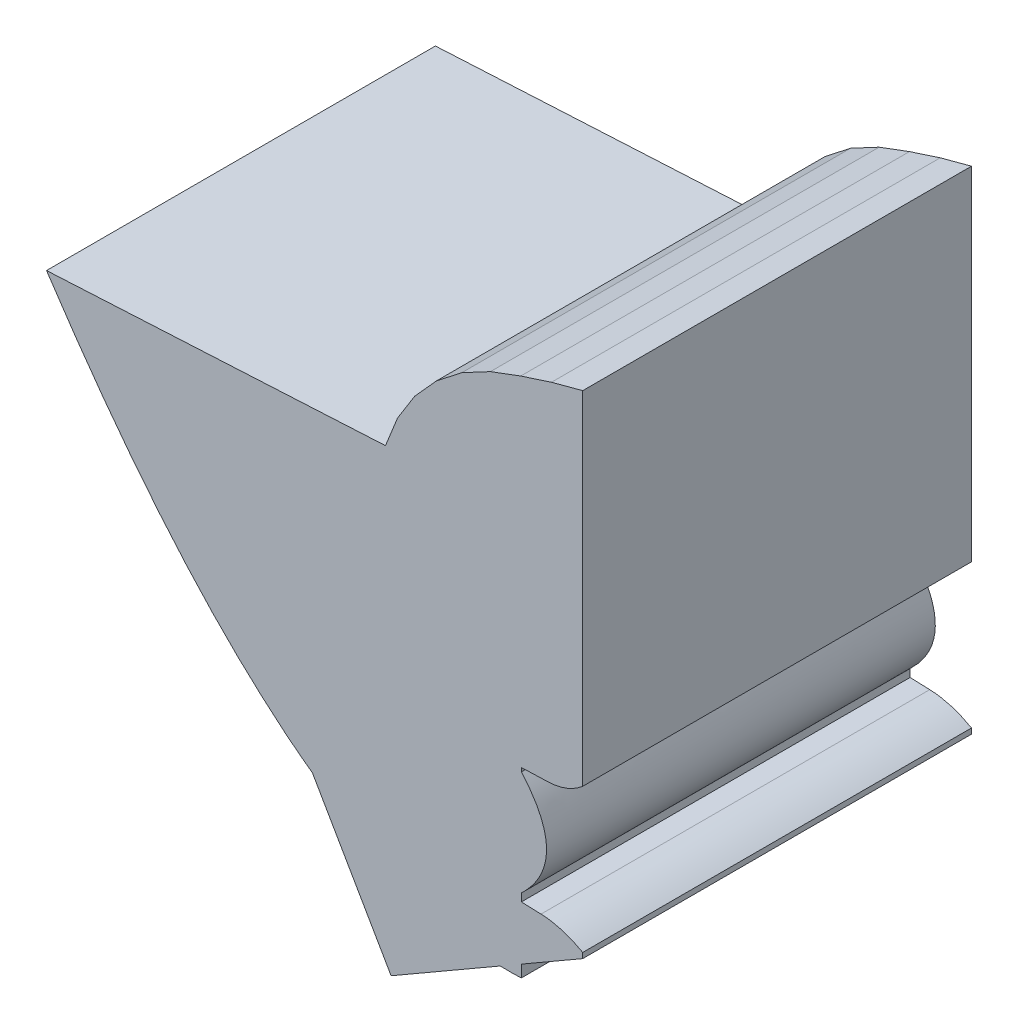
ISO-10303-21;
HEADER;
FILE_DESCRIPTION(('STEP AP214'),'2;1');
FILE_NAME('part.step','',(''),(''),'','','');
FILE_SCHEMA(('AUTOMOTIVE_DESIGN { 1 0 10303 214 1 1 1 1 }'));
ENDSEC;
DATA;
#1=APPLICATION_CONTEXT('core data for automotive mechanical design processes');
#2=APPLICATION_PROTOCOL_DEFINITION('international standard','automotive_design',2000,#1);
#3=PRODUCT_CONTEXT('',#1,'mechanical');
#4=PRODUCT('Part','Part','',(#3));
#5=PRODUCT_RELATED_PRODUCT_CATEGORY('part','',(#4));
#6=PRODUCT_DEFINITION_FORMATION('','',#4);
#7=PRODUCT_DEFINITION_CONTEXT('part definition',#1,'design');
#8=PRODUCT_DEFINITION('design','',#6,#7);
#9=PRODUCT_DEFINITION_SHAPE('','',#8);
#10=(LENGTH_UNIT() NAMED_UNIT(*) SI_UNIT(.MILLI.,.METRE.));
#11=(NAMED_UNIT(*) PLANE_ANGLE_UNIT() SI_UNIT($,.RADIAN.));
#12=(NAMED_UNIT(*) SI_UNIT($,.STERADIAN.) SOLID_ANGLE_UNIT());
#13=UNCERTAINTY_MEASURE_WITH_UNIT(LENGTH_MEASURE(1.E-05),#10,'distance_accuracy_value','');
#14=(GEOMETRIC_REPRESENTATION_CONTEXT(3) GLOBAL_UNCERTAINTY_ASSIGNED_CONTEXT((#13)) GLOBAL_UNIT_ASSIGNED_CONTEXT((#10,
#11,#12)) REPRESENTATION_CONTEXT('',''));
#15=CARTESIAN_POINT('',(0.,0.,0.));
#16=DIRECTION('',(0.,0.,1.));
#17=DIRECTION('',(1.,0.,0.));
#18=AXIS2_PLACEMENT_3D('',#15,#16,#17);
#19=CARTESIAN_POINT('',(-2.17733041778456,0.,7.21));
#20=DIRECTION('',(1.,0.,0.));
#21=DIRECTION('',(0.,1.,0.));
#22=AXIS2_PLACEMENT_3D('',#19,#20,#21);
#23=PLANE('',#22);
#24=DIRECTION('',(0.,1.,0.));
#25=VECTOR('',#24,1.);
#26=CARTESIAN_POINT('',(-2.17733041778456,0.,7.21));
#27=LINE('',#26,#25);
#28=CARTESIAN_POINT('',(-2.17733041779455,-1.68817652024789,7.21));
#29=VERTEX_POINT('',#28);
#30=CARTESIAN_POINT('',(-2.17733041778456,-1.97588987280662,7.21));
#31=VERTEX_POINT('',#30);
#32=EDGE_CURVE('E331',#29,#31,#27,.F.);
#33=ORIENTED_EDGE('',*,*,#32,.T.);
#34=DIRECTION('',(0.,0.,-1.));
#35=VECTOR('',#34,1.);
#36=CARTESIAN_POINT('',(-2.17733041778456,-1.97588987280662,7.21));
#37=LINE('',#36,#35);
#38=CARTESIAN_POINT('',(-2.17733041778456,-1.97588987280662,-7.21));
#39=VERTEX_POINT('',#38);
#40=EDGE_CURVE('E707',#31,#39,#37,.T.);
#41=ORIENTED_EDGE('',*,*,#40,.T.);
#42=DIRECTION('',(0.,1.,0.));
#43=VECTOR('',#42,1.);
#44=CARTESIAN_POINT('',(-2.17733041778456,0.,-7.21));
#45=LINE('',#44,#43);
#46=CARTESIAN_POINT('',(-2.17733041778456,-1.68817652020115,-7.21));
#47=VERTEX_POINT('',#46);
#48=EDGE_CURVE('E239',#47,#39,#45,.F.);
#49=ORIENTED_EDGE('',*,*,#48,.F.);
#50=DIRECTION('',(0.,0.,-1.));
#51=VECTOR('',#50,1.);
#52=CARTESIAN_POINT('',(-2.17733041778328,-1.68817652023794,30.8299178698776));
#53=LINE('',#52,#51);
#54=EDGE_CURVE('E306',#29,#47,#53,.T.);
#55=ORIENTED_EDGE('',*,*,#54,.F.);
#56=EDGE_LOOP('',(#33,#41,#49,#55));
#57=FACE_BOUND('',#56,.T.);
#58=ADVANCED_FACE('F60',(#57),#23,.T.);
#59=CARTESIAN_POINT('',(-2.17733041778456,-3.97362839535961,-7.21));
#60=VERTEX_POINT('',#59);
#61=CARTESIAN_POINT('',(-2.17733041883694,-4.4181521924004,-7.21253661769719));
#62=VERTEX_POINT('',#61);
#63=EDGE_CURVE('E291',#60,#62,#45,.F.);
#64=ORIENTED_EDGE('',*,*,#63,.F.);
#65=DIRECTION('',(0.,0.,1.));
#66=VECTOR('',#65,1.);
#67=CARTESIAN_POINT('',(-2.17733041778456,-3.97362839535961,7.21));
#68=LINE('',#67,#66);
#69=CARTESIAN_POINT('',(-2.17733041778456,-3.97362839535961,7.21));
#70=VERTEX_POINT('',#69);
#71=EDGE_CURVE('E277',#60,#70,#68,.T.);
#72=ORIENTED_EDGE('',*,*,#71,.T.);
#73=CARTESIAN_POINT('',(-2.17733041778728,-4.418152192393,7.21251805157701));
#74=VERTEX_POINT('',#73);
#75=EDGE_CURVE('E315',#70,#74,#27,.F.);
#76=ORIENTED_EDGE('',*,*,#75,.T.);
#77=DIRECTION('',(0.,0.,1.));
#78=VECTOR('',#77,1.);
#79=CARTESIAN_POINT('',(-2.17733041988932,-4.41815219245795,-7.21507323539439));
#80=LINE('',#79,#78);
#81=EDGE_CURVE('E297',#62,#74,#80,.T.);
#82=ORIENTED_EDGE('',*,*,#81,.F.);
#83=EDGE_LOOP('',(#64,#72,#76,#82));
#84=FACE_BOUND('',#83,.T.);
#85=ADVANCED_FACE('F300',(#84),#23,.T.);
#86=CARTESIAN_POINT('',(-82931.1005830976,996560.072871644,30.8299178698776));
#87=CARTESIAN_POINT('',(87153.8887538027,-996199.093812144,30.8299178698776));
#88=CARTESIAN_POINT('',(-91384.0928999308,995820.531871049,30.8299178698776));
#89=B_SPLINE_CURVE_WITH_KNOTS('',2,(#86,#87,#88),.UNSPECIFIED.,.F.,.F.,(3,3),(0.,1.),.UNSPECIFIED.);
#90=DIRECTION('',(0.,0.,-1.));
#91=VECTOR('',#90,1.);
#92=SURFACE_OF_LINEAR_EXTRUSION('',#89,#91);
#93=CARTESIAN_POINT('',(-10.3360060158833,-1.39847805226083,-7.21));
#94=CARTESIAN_POINT('',(-10.1317122861946,-1.55409126755817,-7.21));
#95=CARTESIAN_POINT('',(-9.92811739885524,-1.70171667825081,-7.21));
#96=B_SPLINE_CURVE_WITH_KNOTS('',2,(#93,#94,#95),.UNSPECIFIED.,.F.,.F.,(3,3),(0.500920252473167,
0.500965025000237),.UNSPECIFIED.);
#97=CARTESIAN_POINT('',(-10.3360060158632,-1.39847805228234,-7.2125366176972));
#98=VERTEX_POINT('',#97);
#99=CARTESIAN_POINT('',(-9.92811739884048,-1.70171667826735,-7.21));
#100=VERTEX_POINT('',#99);
#101=EDGE_CURVE('E684',#98,#100,#96,.T.);
#102=ORIENTED_EDGE('',*,*,#101,.T.);
#103=CARTESIAN_POINT('',(-9.92303039020492,-1.70540406952979,-7.21));
#104=DIRECTION('',(0.,0.,1.));
#105=VECTOR('',#104,1.);
#106=LINE('',#103,#105);
#107=CARTESIAN_POINT('',(-9.92811740939357,-1.70171667064013,7.21));
#108=VERTEX_POINT('',#107);
#109=EDGE_CURVE('E13',#100,#108,#106,.T.);
#110=ORIENTED_EDGE('',*,*,#109,.T.);
#111=CARTESIAN_POINT('',(-9.9281174093746,-1.70171667065055,7.21));
#112=CARTESIAN_POINT('',(-10.1317122914709,-1.55409126356634,7.21));
#113=CARTESIAN_POINT('',(-10.3360060158804,-1.39847805229025,7.20999999999999));
#114=B_SPLINE_CURVE_WITH_KNOTS('',2,(#111,#112,#113),.UNSPECIFIED.,.F.,.F.,(3,3),
(0.500920252474324,0.500965025000236),.UNSPECIFIED.);
#115=CARTESIAN_POINT('',(-10.3360060158816,-1.39847805227263,7.21251805157951));
#116=VERTEX_POINT('',#115);
#117=EDGE_CURVE('E470',#116,#108,#114,.F.);
#118=ORIENTED_EDGE('',*,*,#117,.F.);
#119=CARTESIAN_POINT('',(-10.336006015861,-1.39847805228632,7.21));
#120=CARTESIAN_POINT('',(-10.6228848167366,-1.17995870432205,7.21));
#121=CARTESIAN_POINT('',(-10.9111416710362,-0.945688133646021,7.21));
#122=B_SPLINE_CURVE_WITH_KNOTS('',2,(#119,#120,#121),.UNSPECIFIED.,.F.,.F.,(3,3),
(0.500965025000234,0.501027896674745),.UNSPECIFIED.);
#123=CARTESIAN_POINT('',(-10.9111416711035,-0.945688133586594,7.21251805157951));
#124=VERTEX_POINT('',#123);
#125=EDGE_CURVE('E325',#124,#116,#122,.F.);
#126=ORIENTED_EDGE('',*,*,#125,.F.);
#127=CARTESIAN_POINT('',(-10.9111416711694,-0.945688133531575,7.21));
#128=CARTESIAN_POINT('',(-15.1971813204195,2.53763911301365,7.21));
#129=CARTESIAN_POINT('',(-19.7878835648669,9.50327575735757,7.21));
#130=B_SPLINE_CURVE_WITH_KNOTS('',2,(#127,#128,#129),.UNSPECIFIED.,.F.,.F.,(3,3),
(0.501027896674761,0.501962724366634),.UNSPECIFIED.);
#131=CARTESIAN_POINT('',(-19.7878835648708,9.50327575735899,7.21251805157951));
#132=VERTEX_POINT('',#131);
#133=EDGE_CURVE('E345',#132,#124,#130,.F.);
#134=ORIENTED_EDGE('',*,*,#133,.F.);
#135=DIRECTION('',(0.,0.,1.));
#136=VECTOR('',#135,1.);
#137=CARTESIAN_POINT('',(-19.7878835648708,9.50327575735899,-7.21507323539439));
#138=LINE('',#137,#136);
#139=CARTESIAN_POINT('',(-19.7878835648708,9.50327575735899,-7.21253661769719));
#140=VERTEX_POINT('',#139);
#141=EDGE_CURVE('E467',#140,#132,#138,.T.);
#142=ORIENTED_EDGE('',*,*,#141,.F.);
#143=CARTESIAN_POINT('',(-19.7878835648714,9.50327575734023,-7.21));
#144=CARTESIAN_POINT('',(-15.197181319061,2.53763911092818,-7.21));
#145=CARTESIAN_POINT('',(-10.9111416686287,-0.945688135617351,-7.21));
#146=B_SPLINE_CURVE_WITH_KNOTS('',2,(#143,#144,#145),.UNSPECIFIED.,.F.,.F.,(3,3),
(0.501027896674483,0.501962724366634),.UNSPECIFIED.);
#147=CARTESIAN_POINT('',(-10.9111416684846,-0.945688135711886,-7.21253661769719));
#148=VERTEX_POINT('',#147);
#149=EDGE_CURVE('E465',#140,#148,#146,.T.);
#150=ORIENTED_EDGE('',*,*,#149,.T.);
#151=CARTESIAN_POINT('',(-10.9111416684921,-0.945688135713634,-7.21));
#152=CARTESIAN_POINT('',(-10.6228848154707,-1.17995870528634,-7.21));
#153=CARTESIAN_POINT('',(-10.336006015861,-1.39847805228632,-7.21));
#154=B_SPLINE_CURVE_WITH_KNOTS('',2,(#151,#152,#153),.UNSPECIFIED.,.F.,.F.,(3,3),
(0.500965025000234,0.501027896674468),.UNSPECIFIED.);
#155=EDGE_CURVE('E301',#148,#98,#154,.T.);
#156=ORIENTED_EDGE('',*,*,#155,.T.);
#157=EDGE_LOOP('',(#102,#110,#118,#126,#134,#142,#150,#156));
#158=FACE_BOUND('',#157,.T.);
#159=ADVANCED_FACE('F351',(#158),#92,.T.);
#160=CARTESIAN_POINT('',(-2.17733041779322,-4.41815219232809,7.21));
#161=CARTESIAN_POINT('',(-2.56635847851917,-4.43811718715954,7.21));
#162=CARTESIAN_POINT('',(-2.95832165330017,-4.42453367482725,7.21));
#163=B_SPLINE_CURVE_WITH_KNOTS('',2,(#160,#161,#162),.UNSPECIFIED.,.F.,.F.,(3,3),
(0.500038190982026,0.500129946985932),.UNSPECIFIED.);
#164=CARTESIAN_POINT('',(-2.95832155779568,-4.42453384027707,7.21));
#165=VERTEX_POINT('',#164);
#166=EDGE_CURVE('E449',#165,#74,#163,.F.);
#167=ORIENTED_EDGE('',*,*,#166,.F.);
#168=DIRECTION('',(0.,0.,-1.));
#169=VECTOR('',#168,1.);
#170=CARTESIAN_POINT('',(-2.95832129285944,-4.42453368731519,0.));
#171=LINE('',#170,#169);
#172=CARTESIAN_POINT('',(-2.95832165333745,-4.42453367485076,-7.21));
#173=VERTEX_POINT('',#172);
#174=EDGE_CURVE('E69',#165,#173,#171,.T.);
#175=ORIENTED_EDGE('',*,*,#174,.T.);
#176=CARTESIAN_POINT('',(-2.95832165333676,-4.42453367484836,-7.21));
#177=CARTESIAN_POINT('',(-2.56635847959284,-4.43811718714624,-7.21));
#178=CARTESIAN_POINT('',(-2.17733041988843,-4.41815219245793,-7.21));
#179=B_SPLINE_CURVE_WITH_KNOTS('',2,(#176,#177,#178),.UNSPECIFIED.,.F.,.F.,(3,3),
(0.500038190982273,0.500129946985936),.UNSPECIFIED.);
#180=EDGE_CURVE('E335',#173,#62,#179,.T.);
#181=ORIENTED_EDGE('',*,*,#180,.T.);
#182=ORIENTED_EDGE('',*,*,#81,.T.);
#183=EDGE_LOOP('',(#167,#175,#181,#182));
#184=FACE_BOUND('',#183,.T.);
#185=ADVANCED_FACE('F365',(#184),#92,.T.);
#186=DIRECTION('',(0.,1.,0.));
#187=VECTOR('',#186,1.);
#188=CARTESIAN_POINT('',(-2.17733041778456,0.,-7.21));
#189=LINE('',#188,#187);
#190=CARTESIAN_POINT('',(-2.17733041778456,2.34248700715526,-7.21));
#191=VERTEX_POINT('',#190);
#192=CARTESIAN_POINT('',(-2.17733041777607,2.20172974209443,-7.21));
#193=VERTEX_POINT('',#192);
#194=EDGE_CURVE('E303',#191,#193,#189,.F.);
#195=ORIENTED_EDGE('',*,*,#194,.F.);
#196=DIRECTION('',(0.,0.,-1.));
#197=VECTOR('',#196,1.);
#198=CARTESIAN_POINT('',(-2.17733041778456,2.34248700715526,24.0565253000013));
#199=LINE('',#198,#197);
#200=CARTESIAN_POINT('',(-2.17733041778456,2.34248700715526,7.21));
#201=VERTEX_POINT('',#200);
#202=EDGE_CURVE('E527',#201,#191,#199,.T.);
#203=ORIENTED_EDGE('',*,*,#202,.F.);
#204=DIRECTION('',(0.,1.,0.));
#205=VECTOR('',#204,1.);
#206=CARTESIAN_POINT('',(-2.17733041778456,0.,7.21));
#207=LINE('',#206,#205);
#208=CARTESIAN_POINT('',(-2.17733041778074,2.20172974210003,7.21));
#209=VERTEX_POINT('',#208);
#210=EDGE_CURVE('E326',#201,#209,#207,.F.);
#211=ORIENTED_EDGE('',*,*,#210,.T.);
#212=DIRECTION('',(0.,0.,-1.));
#213=VECTOR('',#212,1.);
#214=CARTESIAN_POINT('',(-2.17733041778074,2.20172974210003,30.8299178698776));
#215=LINE('',#214,#213);
#216=EDGE_CURVE('E611',#209,#193,#215,.T.);
#217=ORIENTED_EDGE('',*,*,#216,.T.);
#218=EDGE_LOOP('',(#195,#203,#211,#217));
#219=FACE_BOUND('',#218,.T.);
#220=ADVANCED_FACE('F595',(#219),#23,.T.);
#221=CARTESIAN_POINT('',(0.,0.,7.21));
#222=DIRECTION('',(0.,0.,1.));
#223=DIRECTION('',(1.,0.,0.));
#224=AXIS2_PLACEMENT_3D('',#221,#222,#223);
#225=PLANE('',#224);
#226=ORIENTED_EDGE('',*,*,#75,.F.);
#227=DIRECTION('',(0.866025403785723,0.499999999997775,0.));
#228=VECTOR('',#227,1.);
#229=CARTESIAN_POINT('',(0.100000000004221,-2.65881106562334,7.21));
#230=LINE('',#229,#228);
#231=CARTESIAN_POINT('',(0.100000000004221,-2.65881106562334,7.21));
#232=VERTEX_POINT('',#231);
#233=EDGE_CURVE('E74',#70,#232,#230,.T.);
#234=ORIENTED_EDGE('',*,*,#233,.T.);
#235=DIRECTION('',(-1.62011653008151E-11,1.,0.));
#236=VECTOR('',#235,1.);
#237=CARTESIAN_POINT('',(0.100000000000981,-2.45881106562334,7.21));
#238=LINE('',#237,#236);
#239=CARTESIAN_POINT('',(0.100000000000981,-2.45881106562334,7.21));
#240=VERTEX_POINT('',#239);
#241=EDGE_CURVE('E667',#232,#240,#238,.T.);
#242=ORIENTED_EDGE('',*,*,#241,.T.);
#243=CARTESIAN_POINT('',(-15004.7897636461,-999892.444646946,7.21));
#244=CARTESIAN_POINT('',(17450.906437277,999845.695156391,7.21));
#245=CARTESIAN_POINT('',(-19903.023110908,-999806.945665836,7.21));
#246=B_SPLINE_CURVE_WITH_KNOTS('',2,(#243,#244,#245),.UNSPECIFIED.,.F.,.F.,(3,3),(0.,1.),.UNSPECIFIED.);
#247=CARTESIAN_POINT('',(-1.44765075676889,-2.00137084805176,7.21));
#248=VERTEX_POINT('',#247);
#249=EDGE_CURVE('E671',#240,#248,#246,.T.);
#250=ORIENTED_EDGE('',*,*,#249,.T.);
#251=DIRECTION('',(-0.999390827019096,0.0348994967024967,0.));
#252=VECTOR('',#251,1.);
#253=CARTESIAN_POINT('',(-1.44765075676889,-2.00137084805176,7.21));
#254=LINE('',#253,#252);
#255=EDGE_CURVE('E248',#248,#31,#254,.T.);
#256=ORIENTED_EDGE('',*,*,#255,.T.);
#257=ORIENTED_EDGE('',*,*,#32,.F.);
#258=CARTESIAN_POINT('',(-2.17733041777607,2.20172974209443,7.21));
#259=CARTESIAN_POINT('',(-0.307419303310444,0.0931805865995528,7.21));
#260=CARTESIAN_POINT('',(-2.17733041779435,-1.68817652026,7.21));
#261=B_SPLINE_CURVE_WITH_KNOTS('',2,(#258,#259,#260),.UNSPECIFIED.,.F.,.F.,(3,3),
(0.49947186766891,0.500440643667569),.UNSPECIFIED.);
#262=EDGE_CURVE('E645',#209,#29,#261,.T.);
#263=ORIENTED_EDGE('',*,*,#262,.F.);
#264=ORIENTED_EDGE('',*,*,#210,.F.);
#265=DIRECTION('',(0.999390827019096,0.0348994967025048,0.));
#266=VECTOR('',#265,1.);
#267=CARTESIAN_POINT('',(-2.17733041778456,2.34248700715526,7.21));
#268=LINE('',#267,#266);
#269=CARTESIAN_POINT('',(-1.19050164048462,2.37694782742692,7.21000000000002));
#270=VERTEX_POINT('',#269);
#271=EDGE_CURVE('E474',#201,#270,#268,.T.);
#272=ORIENTED_EDGE('',*,*,#271,.T.);
#273=CARTESIAN_POINT('',(-343900.072311573,939011.080499257,7.21000000000001));
#274=CARTESIAN_POINT('',(342019.599581338,-939690.120785908,7.21000000000001));
#275=CARTESIAN_POINT('',(-340141.301828429,940379.16107256,7.21000000000001));
#276=B_SPLINE_CURVE_WITH_KNOTS('',2,(#273,#274,#275),.UNSPECIFIED.,.F.,.F.,(3,3),(0.,1.),.UNSPECIFIED.);
#277=CARTESIAN_POINT('',(0.100000000004221,2.87767341815847,7.21000000000001));
#278=VERTEX_POINT('',#277);
#279=EDGE_CURVE('E468',#270,#278,#276,.T.);
#280=ORIENTED_EDGE('',*,*,#279,.T.);
#281=DIRECTION('',(0.,1.,0.));
#282=VECTOR('',#281,1.);
#283=CARTESIAN_POINT('',(0.100000000004221,2.87767341815847,7.21));
#284=LINE('',#283,#282);
#285=CARTESIAN_POINT('',(0.100000000004747,15.587903347272,7.21));
#286=VERTEX_POINT('',#285);
#287=EDGE_CURVE('E509',#278,#286,#284,.T.);
#288=ORIENTED_EDGE('',*,*,#287,.T.);
#289=DIRECTION('',(-0.96592582628907,-0.258819045102515,0.));
#290=VECTOR('',#289,1.);
#291=CARTESIAN_POINT('',(-1.05911099154214,15.277320493149,7.21));
#292=LINE('',#291,#290);
#293=CARTESIAN_POINT('',(-1.05911099154214,15.277320493149,7.21000000000001));
#294=VERTEX_POINT('',#293);
#295=EDGE_CURVE('E510',#286,#294,#292,.T.);
#296=ORIENTED_EDGE('',*,*,#295,.T.);
#297=DIRECTION('',(-0.951056516295155,-0.309016994374943,0.));
#298=VECTOR('',#297,1.);
#299=CARTESIAN_POINT('',(-2.20037881109632,14.906500099899,7.21));
#300=LINE('',#299,#298);
#301=CARTESIAN_POINT('',(-2.20037881109632,14.906500099899,7.21000000000001));
#302=VERTEX_POINT('',#301);
#303=EDGE_CURVE('E502',#294,#302,#300,.T.);
#304=ORIENTED_EDGE('',*,*,#303,.T.);
#305=DIRECTION('',(-0.9366721892484,-0.350207381259461,0.));
#306=VECTOR('',#305,1.);
#307=CARTESIAN_POINT('',(-3.3243854381944,14.4862512423877,7.21));
#308=LINE('',#307,#306);
#309=CARTESIAN_POINT('',(-3.3243854381944,14.4862512423877,7.21000000000001));
#310=VERTEX_POINT('',#309);
#311=EDGE_CURVE('E501',#302,#310,#308,.T.);
#312=ORIENTED_EDGE('',*,*,#311,.T.);
#313=DIRECTION('',(-0.882947592859007,-0.46947156278574,0.));
#314=VECTOR('',#313,1.);
#315=CARTESIAN_POINT('',(-4.38392254962521,13.9228853670448,7.21));
#316=LINE('',#315,#314);
#317=CARTESIAN_POINT('',(-4.38392254962521,13.9228853670448,7.21000000000001));
#318=VERTEX_POINT('',#317);
#319=EDGE_CURVE('E498',#310,#318,#316,.T.);
#320=ORIENTED_EDGE('',*,*,#319,.T.);
#321=DIRECTION('',(-0.788010753606726,-0.615661475325654,0.));
#322=VECTOR('',#321,1.);
#323=CARTESIAN_POINT('',(-5.32953545395328,13.184091596654,7.21));
#324=LINE('',#323,#322);
#325=CARTESIAN_POINT('',(-5.32953545395328,13.184091596654,7.21000000000001));
#326=VERTEX_POINT('',#325);
#327=EDGE_CURVE('E492',#318,#326,#324,.T.);
#328=ORIENTED_EDGE('',*,*,#327,.T.);
#329=DIRECTION('',(-0.669130606358526,-0.743144825477694,0.));
#330=VECTOR('',#329,1.);
#331=CARTESIAN_POINT('',(-6.13249218158351,12.2923178060808,7.21));
#332=LINE('',#331,#330);
#333=CARTESIAN_POINT('',(-6.13249218158351,12.2923178060808,7.21000000000001));
#334=VERTEX_POINT('',#333);
#335=EDGE_CURVE('E495',#326,#334,#332,.T.);
#336=ORIENTED_EDGE('',*,*,#335,.T.);
#337=DIRECTION('',(-0.52991926423321,-0.848048096156423,0.));
#338=VECTOR('',#337,1.);
#339=CARTESIAN_POINT('',(-6.76839529866336,11.2746600906931,7.21));
#340=LINE('',#339,#338);
#341=CARTESIAN_POINT('',(-6.76839529866336,11.2746600906931,7.21000000000001));
#342=VERTEX_POINT('',#341);
#343=EDGE_CURVE('E490',#334,#342,#340,.T.);
#344=ORIENTED_EDGE('',*,*,#343,.T.);
#345=DIRECTION('',(-0.374606593415918,-0.927183854566785,0.));
#346=VECTOR('',#345,1.);
#347=CARTESIAN_POINT('',(-7.21792321076246,10.1620394652129,7.21));
#348=LINE('',#347,#346);
#349=CARTESIAN_POINT('',(-7.21792321076246,10.1620394652129,7.21000000000001));
#350=VERTEX_POINT('',#349);
#351=EDGE_CURVE('E479',#342,#350,#348,.T.);
#352=ORIENTED_EDGE('',*,*,#351,.T.);
#353=DIRECTION('',(-0.998629534754494,-0.0523359562444688,0.));
#354=VECTOR('',#353,1.);
#355=CARTESIAN_POINT('',(-10.3098203952063,10.,7.21));
#356=LINE('',#355,#354);
#357=EDGE_CURVE('E318',#350,#132,#356,.T.);
#358=ORIENTED_EDGE('',*,*,#357,.T.);
#359=ORIENTED_EDGE('',*,*,#133,.T.);
#360=ORIENTED_EDGE('',*,*,#125,.T.);
#361=ORIENTED_EDGE('',*,*,#117,.T.);
#362=DIRECTION('',(0.500000000000004,-0.866025403784436,0.));
#363=VECTOR('',#362,1.);
#364=CARTESIAN_POINT('',(-9.92906628699395,-1.70519329135708,7.21));
#365=LINE('',#364,#363);
#366=CARTESIAN_POINT('',(-7.00887110624745,-6.76311971242774,7.21));
#367=VERTEX_POINT('',#366);
#368=EDGE_CURVE('E669',#108,#367,#365,.T.);
#369=ORIENTED_EDGE('',*,*,#368,.T.);
#370=EDGE_CURVE('E274',#367,#165,#230,.T.);
#371=ORIENTED_EDGE('',*,*,#370,.T.);
#372=ORIENTED_EDGE('',*,*,#166,.T.);
#373=EDGE_LOOP('',(#226,#234,#242,#250,#256,#257,#263,#264,#272,#280,#288,#296,#304,#312,#320,
#328,#336,#344,#352,#358,#359,#360,#361,#369,#371,#372));
#374=FACE_BOUND('',#373,.T.);
#375=ADVANCED_FACE('F423',(#374),#225,.T.);
#376=CARTESIAN_POINT('',(0.,0.,-7.21));
#377=DIRECTION('',(0.,0.,1.));
#378=DIRECTION('',(1.,0.,0.));
#379=AXIS2_PLACEMENT_3D('',#376,#377,#378);
#380=PLANE('',#379);
#381=ORIENTED_EDGE('',*,*,#48,.T.);
#382=DIRECTION('',(0.999390827019096,-0.0348994967024967,0.));
#383=VECTOR('',#382,1.);
#384=CARTESIAN_POINT('',(-1.44765075676889,-2.00137084805176,-7.21));
#385=LINE('',#384,#383);
#386=CARTESIAN_POINT('',(-1.44765075676889,-2.00137084805176,-7.21));
#387=VERTEX_POINT('',#386);
#388=EDGE_CURVE('E235',#39,#387,#385,.T.);
#389=ORIENTED_EDGE('',*,*,#388,.T.);
#390=CARTESIAN_POINT('',(-15004.7897636461,-999892.444646946,-7.21));
#391=CARTESIAN_POINT('',(17450.906437277,999845.695156391,-7.21));
#392=CARTESIAN_POINT('',(-19903.023110908,-999806.945665836,-7.21));
#393=B_SPLINE_CURVE_WITH_KNOTS('',2,(#390,#391,#392),.UNSPECIFIED.,.F.,.F.,(3,3),(0.,1.),.UNSPECIFIED.);
#394=CARTESIAN_POINT('',(0.100000000000981,-2.45881106562334,-7.21));
#395=VERTEX_POINT('',#394);
#396=EDGE_CURVE('E240',#387,#395,#393,.F.);
#397=ORIENTED_EDGE('',*,*,#396,.T.);
#398=DIRECTION('',(1.62011653008151E-11,-1.,0.));
#399=VECTOR('',#398,1.);
#400=CARTESIAN_POINT('',(0.100000000000981,-2.45881106562334,-7.21));
#401=LINE('',#400,#399);
#402=CARTESIAN_POINT('',(0.100000000004221,-2.65881106562334,-7.21));
#403=VERTEX_POINT('',#402);
#404=EDGE_CURVE('E256',#395,#403,#401,.T.);
#405=ORIENTED_EDGE('',*,*,#404,.T.);
#406=DIRECTION('',(-0.866025403785723,-0.499999999997775,0.));
#407=VECTOR('',#406,1.);
#408=CARTESIAN_POINT('',(0.100000000004221,-2.65881106562334,-7.21));
#409=LINE('',#408,#407);
#410=EDGE_CURVE('E259',#403,#60,#409,.T.);
#411=ORIENTED_EDGE('',*,*,#410,.T.);
#412=ORIENTED_EDGE('',*,*,#63,.T.);
#413=ORIENTED_EDGE('',*,*,#180,.F.);
#414=CARTESIAN_POINT('',(-7.00887110624745,-6.76311971242774,-7.21));
#415=VERTEX_POINT('',#414);
#416=EDGE_CURVE('E82',#173,#415,#409,.T.);
#417=ORIENTED_EDGE('',*,*,#416,.T.);
#418=DIRECTION('',(-0.500000000000004,0.866025403784436,0.));
#419=VECTOR('',#418,1.);
#420=CARTESIAN_POINT('',(-9.92906628699395,-1.70519329135708,-7.21));
#421=LINE('',#420,#419);
#422=EDGE_CURVE('E280',#415,#100,#421,.T.);
#423=ORIENTED_EDGE('',*,*,#422,.T.);
#424=ORIENTED_EDGE('',*,*,#101,.F.);
#425=ORIENTED_EDGE('',*,*,#155,.F.);
#426=ORIENTED_EDGE('',*,*,#149,.F.);
#427=DIRECTION('',(-0.998629534754494,-0.0523359562444688,0.));
#428=VECTOR('',#427,1.);
#429=CARTESIAN_POINT('',(-0.550881453784725,10.5114443180936,-7.21));
#430=LINE('',#429,#428);
#431=CARTESIAN_POINT('',(-7.21792321076246,10.1620394652129,-7.21));
#432=VERTEX_POINT('',#431);
#433=EDGE_CURVE('E455',#432,#140,#430,.T.);
#434=ORIENTED_EDGE('',*,*,#433,.F.);
#435=DIRECTION('',(0.374606593415918,0.927183854566785,0.));
#436=VECTOR('',#435,1.);
#437=CARTESIAN_POINT('',(-7.21792321076246,10.1620394652129,-7.21));
#438=LINE('',#437,#436);
#439=CARTESIAN_POINT('',(-6.76839529866336,11.2746600906931,-7.21));
#440=VERTEX_POINT('',#439);
#441=EDGE_CURVE('E765',#432,#440,#438,.T.);
#442=ORIENTED_EDGE('',*,*,#441,.T.);
#443=DIRECTION('',(0.52991926423321,0.848048096156423,0.));
#444=VECTOR('',#443,1.);
#445=CARTESIAN_POINT('',(-6.76839529866336,11.2746600906931,-7.21));
#446=LINE('',#445,#444);
#447=CARTESIAN_POINT('',(-6.13249218158351,12.2923178060808,-7.21));
#448=VERTEX_POINT('',#447);
#449=EDGE_CURVE('E764',#440,#448,#446,.T.);
#450=ORIENTED_EDGE('',*,*,#449,.T.);
#451=DIRECTION('',(0.669130606358526,0.743144825477694,0.));
#452=VECTOR('',#451,1.);
#453=CARTESIAN_POINT('',(-6.13249218158351,12.2923178060808,-7.21));
#454=LINE('',#453,#452);
#455=CARTESIAN_POINT('',(-5.32953545395328,13.184091596654,-7.21));
#456=VERTEX_POINT('',#455);
#457=EDGE_CURVE('E767',#448,#456,#454,.T.);
#458=ORIENTED_EDGE('',*,*,#457,.T.);
#459=DIRECTION('',(0.788010753606726,0.615661475325654,0.));
#460=VECTOR('',#459,1.);
#461=CARTESIAN_POINT('',(-5.32953545395328,13.184091596654,-7.21));
#462=LINE('',#461,#460);
#463=CARTESIAN_POINT('',(-4.38392254962521,13.9228853670448,-7.21));
#464=VERTEX_POINT('',#463);
#465=EDGE_CURVE('E772',#456,#464,#462,.T.);
#466=ORIENTED_EDGE('',*,*,#465,.T.);
#467=DIRECTION('',(0.882947592859007,0.46947156278574,0.));
#468=VECTOR('',#467,1.);
#469=CARTESIAN_POINT('',(-4.38392254962521,13.9228853670448,-7.21));
#470=LINE('',#469,#468);
#471=CARTESIAN_POINT('',(-3.3243854381944,14.4862512423877,-7.21));
#472=VERTEX_POINT('',#471);
#473=EDGE_CURVE('E774',#464,#472,#470,.T.);
#474=ORIENTED_EDGE('',*,*,#473,.T.);
#475=DIRECTION('',(0.9366721892484,0.350207381259461,0.));
#476=VECTOR('',#475,1.);
#477=CARTESIAN_POINT('',(-3.3243854381944,14.4862512423877,-7.21));
#478=LINE('',#477,#476);
#479=CARTESIAN_POINT('',(-2.20037881109632,14.906500099899,-7.21000000000001));
#480=VERTEX_POINT('',#479);
#481=EDGE_CURVE('E710',#472,#480,#478,.T.);
#482=ORIENTED_EDGE('',*,*,#481,.T.);
#483=DIRECTION('',(0.951056516295155,0.309016994374943,0.));
#484=VECTOR('',#483,1.);
#485=CARTESIAN_POINT('',(-2.20037881109632,14.906500099899,-7.21));
#486=LINE('',#485,#484);
#487=CARTESIAN_POINT('',(-1.05911099154214,15.277320493149,-7.21));
#488=VERTEX_POINT('',#487);
#489=EDGE_CURVE('E485',#480,#488,#486,.T.);
#490=ORIENTED_EDGE('',*,*,#489,.T.);
#491=DIRECTION('',(0.96592582628907,0.258819045102515,0.));
#492=VECTOR('',#491,1.);
#493=CARTESIAN_POINT('',(-1.05911099154214,15.277320493149,-7.21));
#494=LINE('',#493,#492);
#495=CARTESIAN_POINT('',(0.100000000004747,15.587903347272,-7.21));
#496=VERTEX_POINT('',#495);
#497=EDGE_CURVE('E743',#488,#496,#494,.T.);
#498=ORIENTED_EDGE('',*,*,#497,.T.);
#499=DIRECTION('',(0.,-1.,0.));
#500=VECTOR('',#499,1.);
#501=CARTESIAN_POINT('',(0.100000000004221,2.87767341815847,-7.21));
#502=LINE('',#501,#500);
#503=CARTESIAN_POINT('',(0.0999999999995449,2.8776734181557,-7.21000000000001));
#504=VERTEX_POINT('',#503);
#505=EDGE_CURVE('E753',#496,#504,#502,.T.);
#506=ORIENTED_EDGE('',*,*,#505,.T.);
#507=CARTESIAN_POINT('',(-343900.072311573,939011.080499257,-7.21000000000001));
#508=CARTESIAN_POINT('',(342019.599581338,-939690.120785908,-7.21000000000001));
#509=CARTESIAN_POINT('',(-340141.301828429,940379.16107256,-7.21000000000001));
#510=B_SPLINE_CURVE_WITH_KNOTS('',2,(#507,#508,#509),.UNSPECIFIED.,.F.,.F.,(3,3),(0.,1.),.UNSPECIFIED.);
#511=CARTESIAN_POINT('',(-1.19050164048462,2.37694782741517,-7.21));
#512=VERTEX_POINT('',#511);
#513=EDGE_CURVE('E755',#504,#512,#510,.F.);
#514=ORIENTED_EDGE('',*,*,#513,.T.);
#515=DIRECTION('',(-0.999390827019096,-0.0348994967025048,0.));
#516=VECTOR('',#515,1.);
#517=CARTESIAN_POINT('',(-2.17733041778456,2.34248700715526,-7.21));
#518=LINE('',#517,#516);
#519=EDGE_CURVE('E616',#512,#191,#518,.T.);
#520=ORIENTED_EDGE('',*,*,#519,.T.);
#521=ORIENTED_EDGE('',*,*,#194,.T.);
#522=CARTESIAN_POINT('',(-2.17733041776379,-1.68817652023098,-7.21));
#523=CARTESIAN_POINT('',(-0.307419303328964,0.0931805866132554,-7.21));
#524=CARTESIAN_POINT('',(-2.17733041776824,2.20172974208621,-7.21));
#525=B_SPLINE_CURVE_WITH_KNOTS('',2,(#522,#523,#524),.UNSPECIFIED.,.F.,.F.,(3,3),
(0.499471867668912,0.500440643667561),.UNSPECIFIED.);
#526=EDGE_CURVE('E613',#47,#193,#525,.T.);
#527=ORIENTED_EDGE('',*,*,#526,.F.);
#528=EDGE_LOOP('',(#381,#389,#397,#405,#411,#412,#413,#417,#423,#424,#425,#426,#434,#442,#450,
#458,#466,#474,#482,#490,#498,#506,#514,#520,#521,#527));
#529=FACE_BOUND('',#528,.T.);
#530=ADVANCED_FACE('F234',(#529),#380,.F.);
#531=CARTESIAN_POINT('',(-996021.636606251,89148.1321438377,30.8299178698776));
#532=CARTESIAN_POINT('',(996193.448091746,-87155.7427476542,30.8299178698776));
#533=CARTESIAN_POINT('',(-996370.259577241,85163.3533514707,30.8299178698776));
#534=B_SPLINE_CURVE_WITH_KNOTS('',2,(#531,#532,#533),.UNSPECIFIED.,.F.,.F.,(3,3),(0.,1.),.UNSPECIFIED.);
#535=DIRECTION('',(0.,0.,-1.));
#536=VECTOR('',#535,1.);
#537=SURFACE_OF_LINEAR_EXTRUSION('',#534,#536);
#538=ORIENTED_EDGE('',*,*,#216,.F.);
#539=ORIENTED_EDGE('',*,*,#262,.T.);
#540=ORIENTED_EDGE('',*,*,#54,.T.);
#541=ORIENTED_EDGE('',*,*,#526,.T.);
#542=EDGE_LOOP('',(#538,#539,#540,#541));
#543=FACE_BOUND('',#542,.T.);
#544=ADVANCED_FACE('F362',(#543),#537,.T.);
#545=CARTESIAN_POINT('',(-19.7878835648708,9.50327575735899,-7.21507323539439));
#546=DIRECTION('',(-0.0523359562444688,0.998629534754494,0.));
#547=DIRECTION('',(-0.998629534754494,-0.0523359562444688,0.));
#548=AXIS2_PLACEMENT_3D('',#545,#546,#547);
#549=PLANE('',#548);
#550=ORIENTED_EDGE('',*,*,#357,.F.);
#551=DIRECTION('',(0.,0.,-1.));
#552=VECTOR('',#551,1.);
#553=CARTESIAN_POINT('',(-7.21792321076246,10.1620394652129,24.0565253000013));
#554=LINE('',#553,#552);
#555=EDGE_CURVE('E526',#350,#432,#554,.T.);
#556=ORIENTED_EDGE('',*,*,#555,.T.);
#557=ORIENTED_EDGE('',*,*,#433,.T.);
#558=ORIENTED_EDGE('',*,*,#141,.T.);
#559=EDGE_LOOP('',(#550,#556,#557,#558));
#560=FACE_BOUND('',#559,.T.);
#561=ADVANCED_FACE('F361',(#560),#549,.T.);
#562=CARTESIAN_POINT('',(-1.05911099154214,15.277320493149,24.0565253000013));
#563=DIRECTION('',(0.258819045102515,-0.96592582628907,0.));
#564=DIRECTION('',(0.96592582628907,0.258819045102515,0.));
#565=AXIS2_PLACEMENT_3D('',#562,#563,#564);
#566=PLANE('',#565);
#567=ORIENTED_EDGE('',*,*,#295,.F.);
#568=DIRECTION('',(0.,0.,-1.));
#569=VECTOR('',#568,1.);
#570=CARTESIAN_POINT('',(0.100000000004747,15.587903347272,24.0565253000013));
#571=LINE('',#570,#569);
#572=EDGE_CURVE('E516',#286,#496,#571,.T.);
#573=ORIENTED_EDGE('',*,*,#572,.T.);
#574=ORIENTED_EDGE('',*,*,#497,.F.);
#575=DIRECTION('',(0.,0.,-1.));
#576=VECTOR('',#575,1.);
#577=CARTESIAN_POINT('',(-1.05911099154214,15.277320493149,24.0565253000013));
#578=LINE('',#577,#576);
#579=EDGE_CURVE('E514',#294,#488,#578,.T.);
#580=ORIENTED_EDGE('',*,*,#579,.F.);
#581=EDGE_LOOP('',(#567,#573,#574,#580));
#582=FACE_BOUND('',#581,.T.);
#583=ADVANCED_FACE('F582',(#582),#566,.F.);
#584=CARTESIAN_POINT('',(-2.20037881109632,14.906500099899,24.0565253000013));
#585=DIRECTION('',(0.309016994374943,-0.951056516295155,0.));
#586=DIRECTION('',(0.951056516295155,0.309016994374943,0.));
#587=AXIS2_PLACEMENT_3D('',#584,#585,#586);
#588=PLANE('',#587);
#589=ORIENTED_EDGE('',*,*,#303,.F.);
#590=ORIENTED_EDGE('',*,*,#579,.T.);
#591=ORIENTED_EDGE('',*,*,#489,.F.);
#592=DIRECTION('',(0.,0.,-1.));
#593=VECTOR('',#592,1.);
#594=CARTESIAN_POINT('',(-2.20037881109632,14.906500099899,24.0565253000013));
#595=LINE('',#594,#593);
#596=EDGE_CURVE('E513',#302,#480,#595,.T.);
#597=ORIENTED_EDGE('',*,*,#596,.F.);
#598=EDGE_LOOP('',(#589,#590,#591,#597));
#599=FACE_BOUND('',#598,.T.);
#600=ADVANCED_FACE('F576',(#599),#588,.F.);
#601=CARTESIAN_POINT('',(-3.3243854381944,14.4862512423877,24.0565253000013));
#602=DIRECTION('',(0.350207381259461,-0.9366721892484,0.));
#603=DIRECTION('',(0.9366721892484,0.350207381259461,0.));
#604=AXIS2_PLACEMENT_3D('',#601,#602,#603);
#605=PLANE('',#604);
#606=ORIENTED_EDGE('',*,*,#311,.F.);
#607=ORIENTED_EDGE('',*,*,#596,.T.);
#608=ORIENTED_EDGE('',*,*,#481,.F.);
#609=DIRECTION('',(0.,0.,-1.));
#610=VECTOR('',#609,1.);
#611=CARTESIAN_POINT('',(-3.3243854381944,14.4862512423877,24.0565253000013));
#612=LINE('',#611,#610);
#613=EDGE_CURVE('E519',#310,#472,#612,.T.);
#614=ORIENTED_EDGE('',*,*,#613,.F.);
#615=EDGE_LOOP('',(#606,#607,#608,#614));
#616=FACE_BOUND('',#615,.T.);
#617=ADVANCED_FACE('F574',(#616),#605,.F.);
#618=CARTESIAN_POINT('',(-4.38392254962521,13.9228853670448,24.0565253000013));
#619=DIRECTION('',(0.46947156278574,-0.882947592859007,0.));
#620=DIRECTION('',(0.882947592859007,0.46947156278574,0.));
#621=AXIS2_PLACEMENT_3D('',#618,#619,#620);
#622=PLANE('',#621);
#623=ORIENTED_EDGE('',*,*,#319,.F.);
#624=ORIENTED_EDGE('',*,*,#613,.T.);
#625=ORIENTED_EDGE('',*,*,#473,.F.);
#626=DIRECTION('',(0.,0.,-1.));
#627=VECTOR('',#626,1.);
#628=CARTESIAN_POINT('',(-4.38392254962521,13.9228853670448,24.0565253000013));
#629=LINE('',#628,#627);
#630=EDGE_CURVE('E520',#318,#464,#629,.T.);
#631=ORIENTED_EDGE('',*,*,#630,.F.);
#632=EDGE_LOOP('',(#623,#624,#625,#631));
#633=FACE_BOUND('',#632,.T.);
#634=ADVANCED_FACE('F571',(#633),#622,.F.);
#635=CARTESIAN_POINT('',(-5.32953545395328,13.184091596654,24.0565253000013));
#636=DIRECTION('',(0.615661475325654,-0.788010753606726,0.));
#637=DIRECTION('',(0.788010753606726,0.615661475325654,0.));
#638=AXIS2_PLACEMENT_3D('',#635,#636,#637);
#639=PLANE('',#638);
#640=ORIENTED_EDGE('',*,*,#327,.F.);
#641=ORIENTED_EDGE('',*,*,#630,.T.);
#642=ORIENTED_EDGE('',*,*,#465,.F.);
#643=DIRECTION('',(0.,0.,-1.));
#644=VECTOR('',#643,1.);
#645=CARTESIAN_POINT('',(-5.32953545395328,13.184091596654,24.0565253000013));
#646=LINE('',#645,#644);
#647=EDGE_CURVE('E524',#326,#456,#646,.T.);
#648=ORIENTED_EDGE('',*,*,#647,.F.);
#649=EDGE_LOOP('',(#640,#641,#642,#648));
#650=FACE_BOUND('',#649,.T.);
#651=ADVANCED_FACE('F570',(#650),#639,.F.);
#652=CARTESIAN_POINT('',(-6.13249218158351,12.2923178060808,24.0565253000013));
#653=DIRECTION('',(0.743144825477693,-0.669130606358526,0.));
#654=DIRECTION('',(0.669130606358526,0.743144825477694,0.));
#655=AXIS2_PLACEMENT_3D('',#652,#653,#654);
#656=PLANE('',#655);
#657=ORIENTED_EDGE('',*,*,#335,.F.);
#658=ORIENTED_EDGE('',*,*,#647,.T.);
#659=ORIENTED_EDGE('',*,*,#457,.F.);
#660=DIRECTION('',(0.,0.,-1.));
#661=VECTOR('',#660,1.);
#662=CARTESIAN_POINT('',(-6.13249218158351,12.2923178060808,24.0565253000013));
#663=LINE('',#662,#661);
#664=EDGE_CURVE('E521',#334,#448,#663,.T.);
#665=ORIENTED_EDGE('',*,*,#664,.F.);
#666=EDGE_LOOP('',(#657,#658,#659,#665));
#667=FACE_BOUND('',#666,.T.);
#668=ADVANCED_FACE('F563',(#667),#656,.F.);
#669=CARTESIAN_POINT('',(-6.76839529866336,11.2746600906931,24.0565253000013));
#670=DIRECTION('',(0.848048096156423,-0.52991926423321,0.));
#671=DIRECTION('',(0.52991926423321,0.848048096156423,0.));
#672=AXIS2_PLACEMENT_3D('',#669,#670,#671);
#673=PLANE('',#672);
#674=ORIENTED_EDGE('',*,*,#343,.F.);
#675=ORIENTED_EDGE('',*,*,#664,.T.);
#676=ORIENTED_EDGE('',*,*,#449,.F.);
#677=DIRECTION('',(0.,0.,-1.));
#678=VECTOR('',#677,1.);
#679=CARTESIAN_POINT('',(-6.76839529866336,11.2746600906931,24.0565253000013));
#680=LINE('',#679,#678);
#681=EDGE_CURVE('E528',#342,#440,#680,.T.);
#682=ORIENTED_EDGE('',*,*,#681,.F.);
#683=EDGE_LOOP('',(#674,#675,#676,#682));
#684=FACE_BOUND('',#683,.T.);
#685=ADVANCED_FACE('F559',(#684),#673,.F.);
#686=CARTESIAN_POINT('',(-7.21792321076246,10.1620394652129,24.0565253000013));
#687=DIRECTION('',(0.927183854566785,-0.374606593415918,0.));
#688=DIRECTION('',(0.374606593415918,0.927183854566785,0.));
#689=AXIS2_PLACEMENT_3D('',#686,#687,#688);
#690=PLANE('',#689);
#691=ORIENTED_EDGE('',*,*,#351,.F.);
#692=ORIENTED_EDGE('',*,*,#681,.T.);
#693=ORIENTED_EDGE('',*,*,#441,.F.);
#694=ORIENTED_EDGE('',*,*,#555,.F.);
#695=EDGE_LOOP('',(#691,#692,#693,#694));
#696=FACE_BOUND('',#695,.T.);
#697=ADVANCED_FACE('F554',(#696),#690,.F.);
#698=CARTESIAN_POINT('',(-2.17733041778456,2.34248700715526,24.0565253000013));
#699=DIRECTION('',(-0.0348994967025048,0.999390827019096,0.));
#700=DIRECTION('',(-0.999390827019096,-0.0348994967025048,0.));
#701=AXIS2_PLACEMENT_3D('',#698,#699,#700);
#702=PLANE('',#701);
#703=ORIENTED_EDGE('',*,*,#271,.F.);
#704=ORIENTED_EDGE('',*,*,#202,.T.);
#705=ORIENTED_EDGE('',*,*,#519,.F.);
#706=DIRECTION('',(0.,0.,-1.));
#707=VECTOR('',#706,1.);
#708=CARTESIAN_POINT('',(-1.19050164048462,2.37694782742692,24.0565253000013));
#709=LINE('',#708,#707);
#710=EDGE_CURVE('E535',#270,#512,#709,.T.);
#711=ORIENTED_EDGE('',*,*,#710,.F.);
#712=EDGE_LOOP('',(#703,#704,#705,#711));
#713=FACE_BOUND('',#712,.T.);
#714=ADVANCED_FACE('F549',(#713),#702,.F.);
#715=CARTESIAN_POINT('',(-343900.072311573,939011.080499257,24.0565253000013));
#716=CARTESIAN_POINT('',(342019.599581338,-939690.120785908,24.0565253000013));
#717=CARTESIAN_POINT('',(-340141.301828429,940379.16107256,24.0565253000013));
#718=B_SPLINE_CURVE_WITH_KNOTS('',2,(#715,#716,#717),.UNSPECIFIED.,.F.,.F.,(3,3),(0.,1.),.UNSPECIFIED.);
#719=DIRECTION('',(0.,0.,-1.));
#720=VECTOR('',#719,1.);
#721=SURFACE_OF_LINEAR_EXTRUSION('',#718,#720);
#722=ORIENTED_EDGE('',*,*,#279,.F.);
#723=ORIENTED_EDGE('',*,*,#710,.T.);
#724=ORIENTED_EDGE('',*,*,#513,.F.);
#725=DIRECTION('',(0.,0.,-1.));
#726=VECTOR('',#725,1.);
#727=CARTESIAN_POINT('',(0.100000000004221,2.87767341815847,24.0565253000013));
#728=LINE('',#727,#726);
#729=EDGE_CURVE('E515',#278,#504,#728,.T.);
#730=ORIENTED_EDGE('',*,*,#729,.F.);
#731=EDGE_LOOP('',(#722,#723,#724,#730));
#732=FACE_BOUND('',#731,.T.);
#733=ADVANCED_FACE('F543',(#732),#721,.F.);
#734=CARTESIAN_POINT('',(0.100000000004221,2.87767341815847,24.0565253000013));
#735=DIRECTION('',(-1.,0.,0.));
#736=DIRECTION('',(0.,-1.,0.));
#737=AXIS2_PLACEMENT_3D('',#734,#735,#736);
#738=PLANE('',#737);
#739=ORIENTED_EDGE('',*,*,#287,.F.);
#740=ORIENTED_EDGE('',*,*,#729,.T.);
#741=ORIENTED_EDGE('',*,*,#505,.F.);
#742=ORIENTED_EDGE('',*,*,#572,.F.);
#743=EDGE_LOOP('',(#739,#740,#741,#742));
#744=FACE_BOUND('',#743,.T.);
#745=ADVANCED_FACE('F548',(#744),#738,.F.);
#746=CARTESIAN_POINT('',(0.100000000004221,-2.65881106562334,18.4423101038908));
#747=DIRECTION('',(-0.499999999997775,0.866025403785723,0.));
#748=DIRECTION('',(-0.866025403785723,-0.499999999997775,0.));
#749=AXIS2_PLACEMENT_3D('',#746,#747,#748);
#750=PLANE('',#749);
#751=ORIENTED_EDGE('',*,*,#174,.F.);
#752=ORIENTED_EDGE('',*,*,#370,.F.);
#753=DIRECTION('',(0.,0.,-1.));
#754=VECTOR('',#753,1.);
#755=CARTESIAN_POINT('',(-7.00887110624745,-6.76311971242774,18.4423101038908));
#756=LINE('',#755,#754);
#757=EDGE_CURVE('E254',#367,#415,#756,.T.);
#758=ORIENTED_EDGE('',*,*,#757,.T.);
#759=ORIENTED_EDGE('',*,*,#416,.F.);
#760=EDGE_LOOP('',(#751,#752,#758,#759));
#761=FACE_BOUND('',#760,.T.);
#762=ADVANCED_FACE('F683',(#761),#750,.F.);
#763=CARTESIAN_POINT('',(-9.92906628699395,-1.70519329135708,18.4423101038908));
#764=DIRECTION('',(0.866025403784436,0.500000000000004,0.));
#765=DIRECTION('',(-0.500000000000004,0.866025403784436,0.));
#766=AXIS2_PLACEMENT_3D('',#763,#764,#765);
#767=PLANE('',#766);
#768=ORIENTED_EDGE('',*,*,#368,.F.);
#769=ORIENTED_EDGE('',*,*,#109,.F.);
#770=ORIENTED_EDGE('',*,*,#422,.F.);
#771=ORIENTED_EDGE('',*,*,#757,.F.);
#772=EDGE_LOOP('',(#768,#769,#770,#771));
#773=FACE_BOUND('',#772,.T.);
#774=ADVANCED_FACE('F681',(#773),#767,.F.);
#775=CARTESIAN_POINT('',(-1.44765075676889,-2.00137084805176,18.4423101038908));
#776=DIRECTION('',(-0.0348994967024967,-0.999390827019096,0.));
#777=DIRECTION('',(0.999390827019096,-0.0348994967024967,0.));
#778=AXIS2_PLACEMENT_3D('',#775,#776,#777);
#779=PLANE('',#778);
#780=ORIENTED_EDGE('',*,*,#40,.F.);
#781=ORIENTED_EDGE('',*,*,#255,.F.);
#782=DIRECTION('',(0.,0.,-1.));
#783=VECTOR('',#782,1.);
#784=CARTESIAN_POINT('',(-1.44765075676889,-2.00137084805176,18.4423101038908));
#785=LINE('',#784,#783);
#786=EDGE_CURVE('E246',#248,#387,#785,.T.);
#787=ORIENTED_EDGE('',*,*,#786,.T.);
#788=ORIENTED_EDGE('',*,*,#388,.F.);
#789=EDGE_LOOP('',(#780,#781,#787,#788));
#790=FACE_BOUND('',#789,.T.);
#791=ADVANCED_FACE('F250',(#790),#779,.F.);
#792=ORIENTED_EDGE('',*,*,#71,.F.);
#793=ORIENTED_EDGE('',*,*,#410,.F.);
#794=DIRECTION('',(0.,0.,-1.));
#795=VECTOR('',#794,1.);
#796=CARTESIAN_POINT('',(0.100000000004221,-2.65881106562334,18.4423101038908));
#797=LINE('',#796,#795);
#798=EDGE_CURVE('E668',#232,#403,#797,.T.);
#799=ORIENTED_EDGE('',*,*,#798,.F.);
#800=ORIENTED_EDGE('',*,*,#233,.F.);
#801=EDGE_LOOP('',(#792,#793,#799,#800));
#802=FACE_BOUND('',#801,.T.);
#803=ADVANCED_FACE('F670',(#802),#750,.F.);
#804=CARTESIAN_POINT('',(-15004.7897636461,-999892.444646946,18.4423101038908));
#805=CARTESIAN_POINT('',(17450.906437277,999845.695156391,18.4423101038908));
#806=CARTESIAN_POINT('',(-19903.023110908,-999806.945665836,18.4423101038908));
#807=B_SPLINE_CURVE_WITH_KNOTS('',2,(#804,#805,#806),.UNSPECIFIED.,.F.,.F.,(3,3),(0.,1.),.UNSPECIFIED.);
#808=DIRECTION('',(0.,0.,-1.));
#809=VECTOR('',#808,1.);
#810=SURFACE_OF_LINEAR_EXTRUSION('',#807,#809);
#811=ORIENTED_EDGE('',*,*,#249,.F.);
#812=DIRECTION('',(0.,0.,-1.));
#813=VECTOR('',#812,1.);
#814=CARTESIAN_POINT('',(0.100000000000981,-2.45881106562334,18.4423101038908));
#815=LINE('',#814,#813);
#816=EDGE_CURVE('E243',#240,#395,#815,.T.);
#817=ORIENTED_EDGE('',*,*,#816,.T.);
#818=ORIENTED_EDGE('',*,*,#396,.F.);
#819=ORIENTED_EDGE('',*,*,#786,.F.);
#820=EDGE_LOOP('',(#811,#817,#818,#819));
#821=FACE_BOUND('',#820,.T.);
#822=ADVANCED_FACE('F253',(#821),#810,.F.);
#823=CARTESIAN_POINT('',(0.100000000000981,-2.45881106562334,18.4423101038908));
#824=DIRECTION('',(-1.,-1.62011653008151E-11,0.));
#825=DIRECTION('',(1.62011653008151E-11,-1.,0.));
#826=AXIS2_PLACEMENT_3D('',#823,#824,#825);
#827=PLANE('',#826);
#828=ORIENTED_EDGE('',*,*,#241,.F.);
#829=ORIENTED_EDGE('',*,*,#798,.T.);
#830=ORIENTED_EDGE('',*,*,#404,.F.);
#831=ORIENTED_EDGE('',*,*,#816,.F.);
#832=EDGE_LOOP('',(#828,#829,#830,#831));
#833=FACE_BOUND('',#832,.T.);
#834=ADVANCED_FACE('F675',(#833),#827,.F.);
#835=CLOSED_SHELL('',(#58,#85,#159,#185,#220,#375,#530,#544,#561,#583,#600,#617,#634,#651,#668,
#685,#697,#714,#733,#745,#762,#774,#791,#803,#822,#834));
#836=MANIFOLD_SOLID_BREP('B2',#835);
#837=ADVANCED_BREP_SHAPE_REPRESENTATION('',(#18,#836),#14);
#838=SHAPE_DEFINITION_REPRESENTATION(#9,#837);
ENDSEC;
END-ISO-10303-21;
